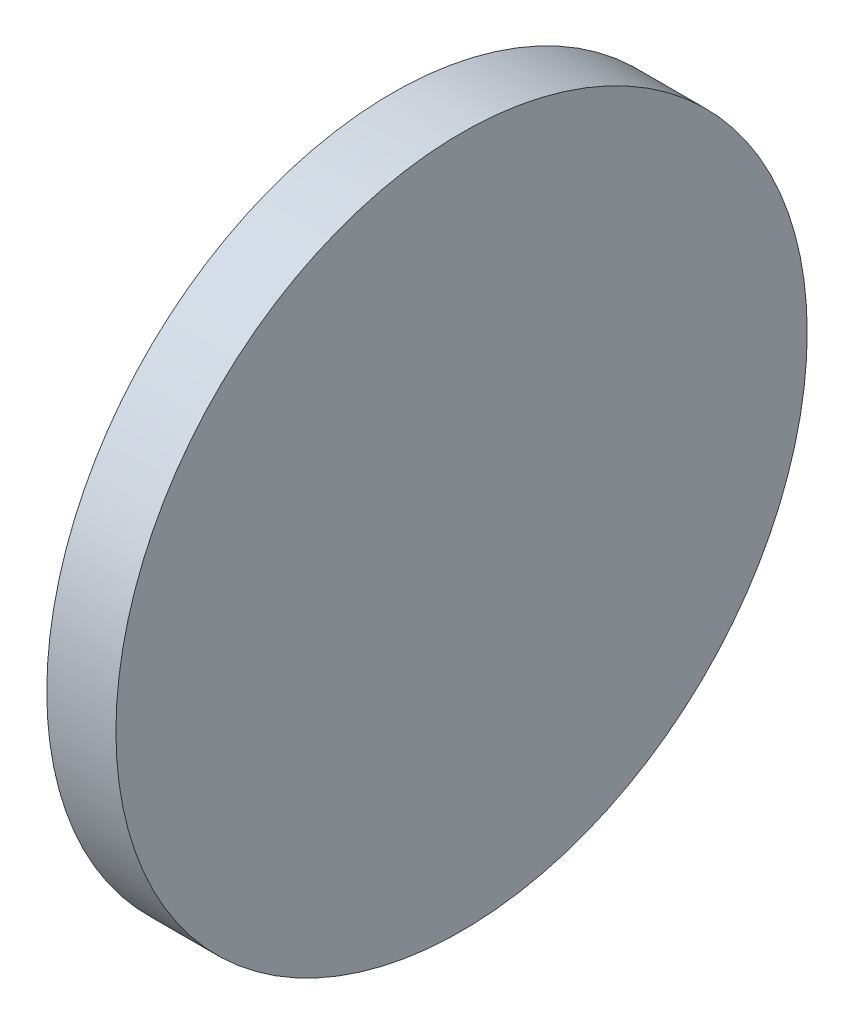
ISO-10303-21;
HEADER;
FILE_DESCRIPTION(('STEP AP214'),'2;1');
FILE_NAME('part.step','',(''),(''),'','','');
FILE_SCHEMA(('AUTOMOTIVE_DESIGN { 1 0 10303 214 1 1 1 1 }'));
ENDSEC;
DATA;
#1=APPLICATION_CONTEXT('core data for automotive mechanical design processes');
#2=APPLICATION_PROTOCOL_DEFINITION('international standard','automotive_design',2000,#1);
#3=PRODUCT_CONTEXT('',#1,'mechanical');
#4=PRODUCT('Part','Part','',(#3));
#5=PRODUCT_RELATED_PRODUCT_CATEGORY('part','',(#4));
#6=PRODUCT_DEFINITION_FORMATION('','',#4);
#7=PRODUCT_DEFINITION_CONTEXT('part definition',#1,'design');
#8=PRODUCT_DEFINITION('design','',#6,#7);
#9=PRODUCT_DEFINITION_SHAPE('','',#8);
#10=(LENGTH_UNIT() NAMED_UNIT(*) SI_UNIT(.MILLI.,.METRE.));
#11=(NAMED_UNIT(*) PLANE_ANGLE_UNIT() SI_UNIT($,.RADIAN.));
#12=(NAMED_UNIT(*) SI_UNIT($,.STERADIAN.) SOLID_ANGLE_UNIT());
#13=UNCERTAINTY_MEASURE_WITH_UNIT(LENGTH_MEASURE(1.E-05),#10,'distance_accuracy_value','');
#14=(GEOMETRIC_REPRESENTATION_CONTEXT(3) GLOBAL_UNCERTAINTY_ASSIGNED_CONTEXT((#13)) GLOBAL_UNIT_ASSIGNED_CONTEXT((#10,
#11,#12)) REPRESENTATION_CONTEXT('',''));
#15=CARTESIAN_POINT('',(0.,0.,0.));
#16=DIRECTION('',(0.,0.,1.));
#17=DIRECTION('',(1.,0.,0.));
#18=AXIS2_PLACEMENT_3D('',#15,#16,#17);
#19=CARTESIAN_POINT('',(10.,0.,0.));
#20=DIRECTION('',(-1.,0.,0.));
#21=DIRECTION('',(0.,0.,1.));
#22=AXIS2_PLACEMENT_3D('',#19,#20,#21);
#23=CYLINDRICAL_SURFACE('',#22,50.);
#24=CARTESIAN_POINT('',(10.,0.,0.));
#25=DIRECTION('',(1.,0.,0.));
#26=DIRECTION('',(0.,0.,-1.));
#27=AXIS2_PLACEMENT_3D('',#24,#25,#26);
#28=CIRCLE('',#27,50.);
#29=CARTESIAN_POINT('',(10.,0.,-50.));
#30=VERTEX_POINT('',#29);
#31=EDGE_CURVE('E10',#30,#30,#28,.T.);
#32=ORIENTED_EDGE('',*,*,#31,.F.);
#33=EDGE_LOOP('',(#32));
#34=FACE_BOUND('',#33,.T.);
#35=CARTESIAN_POINT('',(0.,0.,0.));
#36=DIRECTION('',(1.,0.,0.));
#37=DIRECTION('',(0.,0.,-1.));
#38=AXIS2_PLACEMENT_3D('',#35,#36,#37);
#39=CIRCLE('',#38,50.);
#40=CARTESIAN_POINT('',(0.,0.,-50.));
#41=VERTEX_POINT('',#40);
#42=EDGE_CURVE('E37',#41,#41,#39,.T.);
#43=ORIENTED_EDGE('',*,*,#42,.T.);
#44=EDGE_LOOP('',(#43));
#45=FACE_BOUND('',#44,.T.);
#46=ADVANCED_FACE('F40',(#34,#45),#23,.T.);
#47=CARTESIAN_POINT('',(10.,0.,0.));
#48=DIRECTION('',(1.,0.,0.));
#49=DIRECTION('',(0.,0.,-1.));
#50=AXIS2_PLACEMENT_3D('',#47,#48,#49);
#51=PLANE('',#50);
#52=ORIENTED_EDGE('',*,*,#31,.T.);
#53=EDGE_LOOP('',(#52));
#54=FACE_BOUND('',#53,.T.);
#55=ADVANCED_FACE('F55',(#54),#51,.T.);
#56=CARTESIAN_POINT('',(0.,0.,0.));
#57=DIRECTION('',(1.,0.,0.));
#58=DIRECTION('',(0.,0.,-1.));
#59=AXIS2_PLACEMENT_3D('',#56,#57,#58);
#60=PLANE('',#59);
#61=ORIENTED_EDGE('',*,*,#42,.F.);
#62=EDGE_LOOP('',(#61));
#63=FACE_BOUND('',#62,.T.);
#64=ADVANCED_FACE('F49',(#63),#60,.F.);
#65=CLOSED_SHELL('',(#46,#55,#64));
#66=MANIFOLD_SOLID_BREP('B2',#65);
#67=ADVANCED_BREP_SHAPE_REPRESENTATION('',(#18,#66),#14);
#68=SHAPE_DEFINITION_REPRESENTATION(#9,#67);
ENDSEC;
END-ISO-10303-21;
